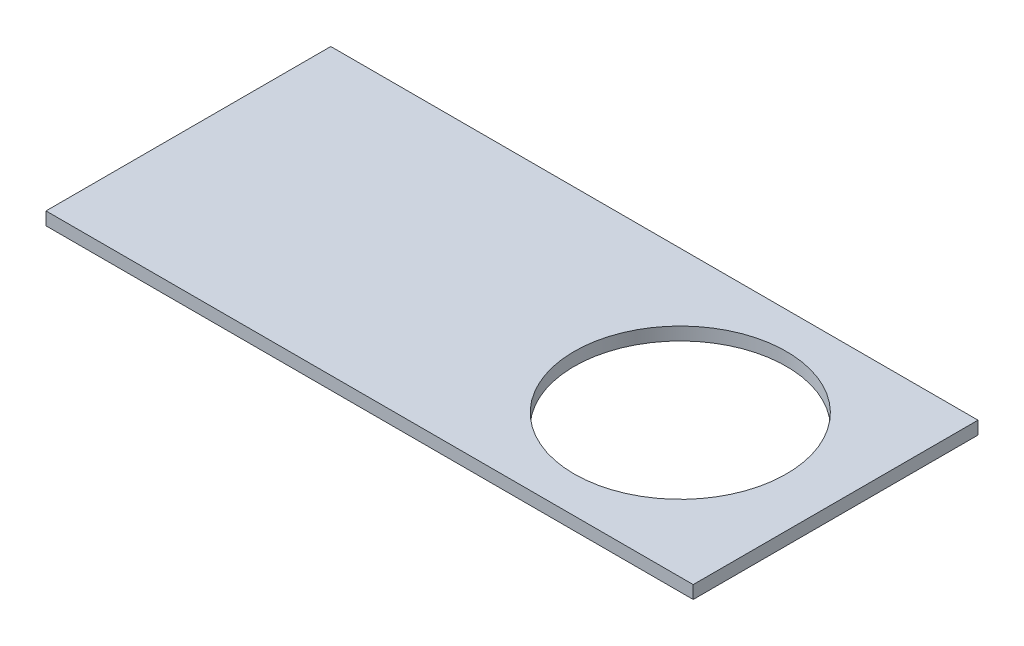
ISO-10303-21;
HEADER;
FILE_DESCRIPTION(('STEP AP214'),'2;1');
FILE_NAME('part.step','',(''),(''),'','','');
FILE_SCHEMA(('AUTOMOTIVE_DESIGN { 1 0 10303 214 1 1 1 1 }'));
ENDSEC;
DATA;
#1=APPLICATION_CONTEXT('core data for automotive mechanical design processes');
#2=APPLICATION_PROTOCOL_DEFINITION('international standard','automotive_design',2000,#1);
#3=PRODUCT_CONTEXT('',#1,'mechanical');
#4=PRODUCT('Part','Part','',(#3));
#5=PRODUCT_RELATED_PRODUCT_CATEGORY('part','',(#4));
#6=PRODUCT_DEFINITION_FORMATION('','',#4);
#7=PRODUCT_DEFINITION_CONTEXT('part definition',#1,'design');
#8=PRODUCT_DEFINITION('design','',#6,#7);
#9=PRODUCT_DEFINITION_SHAPE('','',#8);
#10=(LENGTH_UNIT() NAMED_UNIT(*) SI_UNIT(.MILLI.,.METRE.));
#11=(NAMED_UNIT(*) PLANE_ANGLE_UNIT() SI_UNIT($,.RADIAN.));
#12=(NAMED_UNIT(*) SI_UNIT($,.STERADIAN.) SOLID_ANGLE_UNIT());
#13=UNCERTAINTY_MEASURE_WITH_UNIT(LENGTH_MEASURE(1.E-05),#10,'distance_accuracy_value','');
#14=(GEOMETRIC_REPRESENTATION_CONTEXT(3) GLOBAL_UNCERTAINTY_ASSIGNED_CONTEXT((#13)) GLOBAL_UNIT_ASSIGNED_CONTEXT((#10,
#11,#12)) REPRESENTATION_CONTEXT('',''));
#15=CARTESIAN_POINT('',(0.,0.,0.));
#16=DIRECTION('',(0.,0.,1.));
#17=DIRECTION('',(1.,0.,0.));
#18=AXIS2_PLACEMENT_3D('',#15,#16,#17);
#19=CARTESIAN_POINT('',(0.,5.,0.));
#20=DIRECTION('',(0.,-1.,0.));
#21=DIRECTION('',(0.,0.,-1.));
#22=AXIS2_PLACEMENT_3D('',#19,#20,#21);
#23=PLANE('',#22);
#24=DIRECTION('',(0.,0.,-1.));
#25=VECTOR('',#24,1.);
#26=CARTESIAN_POINT('',(125.,5.,55.));
#27=LINE('',#26,#25);
#28=CARTESIAN_POINT('',(125.,5.,55.));
#29=VERTEX_POINT('',#28);
#30=CARTESIAN_POINT('',(125.,5.,-55.));
#31=VERTEX_POINT('',#30);
#32=EDGE_CURVE('E87',#29,#31,#27,.T.);
#33=ORIENTED_EDGE('',*,*,#32,.T.);
#34=DIRECTION('',(-1.,0.,0.));
#35=VECTOR('',#34,1.);
#36=CARTESIAN_POINT('',(-125.,5.,-54.9999999999999));
#37=LINE('',#36,#35);
#38=CARTESIAN_POINT('',(-125.,5.,-54.9999999999999));
#39=VERTEX_POINT('',#38);
#40=EDGE_CURVE('E82',#31,#39,#37,.T.);
#41=ORIENTED_EDGE('',*,*,#40,.T.);
#42=DIRECTION('',(0.,0.,1.));
#43=VECTOR('',#42,1.);
#44=CARTESIAN_POINT('',(-125.,5.,55.));
#45=LINE('',#44,#43);
#46=CARTESIAN_POINT('',(-125.,5.,55.));
#47=VERTEX_POINT('',#46);
#48=EDGE_CURVE('E85',#39,#47,#45,.T.);
#49=ORIENTED_EDGE('',*,*,#48,.T.);
#50=DIRECTION('',(1.,0.,0.));
#51=VECTOR('',#50,1.);
#52=CARTESIAN_POINT('',(-125.,5.,55.));
#53=LINE('',#52,#51);
#54=EDGE_CURVE('E52',#47,#29,#53,.T.);
#55=ORIENTED_EDGE('',*,*,#54,.T.);
#56=EDGE_LOOP('',(#33,#41,#49,#55));
#57=FACE_BOUND('',#56,.T.);
#58=CARTESIAN_POINT('',(65.,5.,0.));
#59=DIRECTION('',(0.,1.,0.));
#60=DIRECTION('',(0.,0.,1.));
#61=AXIS2_PLACEMENT_3D('',#58,#59,#60);
#62=CIRCLE('',#61,41.);
#63=CARTESIAN_POINT('',(65.,5.,41.));
#64=VERTEX_POINT('',#63);
#65=EDGE_CURVE('E102',#64,#64,#62,.T.);
#66=ORIENTED_EDGE('',*,*,#65,.F.);
#67=EDGE_LOOP('',(#66));
#68=FACE_BOUND('',#67,.T.);
#69=ADVANCED_FACE('F35',(#57,#68),#23,.F.);
#70=CARTESIAN_POINT('',(0.,0.,0.));
#71=DIRECTION('',(0.,-1.,0.));
#72=DIRECTION('',(0.,0.,-1.));
#73=AXIS2_PLACEMENT_3D('',#70,#71,#72);
#74=PLANE('',#73);
#75=DIRECTION('',(0.,0.,-1.));
#76=VECTOR('',#75,1.);
#77=CARTESIAN_POINT('',(125.,0.,55.));
#78=LINE('',#77,#76);
#79=CARTESIAN_POINT('',(125.,0.,55.));
#80=VERTEX_POINT('',#79);
#81=CARTESIAN_POINT('',(125.,0.,-55.));
#82=VERTEX_POINT('',#81);
#83=EDGE_CURVE('E99',#80,#82,#78,.T.);
#84=ORIENTED_EDGE('',*,*,#83,.F.);
#85=DIRECTION('',(1.,0.,0.));
#86=VECTOR('',#85,1.);
#87=CARTESIAN_POINT('',(-125.,0.,55.));
#88=LINE('',#87,#86);
#89=CARTESIAN_POINT('',(-125.,0.,55.));
#90=VERTEX_POINT('',#89);
#91=EDGE_CURVE('E75',#90,#80,#88,.T.);
#92=ORIENTED_EDGE('',*,*,#91,.F.);
#93=DIRECTION('',(0.,0.,1.));
#94=VECTOR('',#93,1.);
#95=CARTESIAN_POINT('',(-125.,0.,55.));
#96=LINE('',#95,#94);
#97=CARTESIAN_POINT('',(-125.,0.,-54.9999999999999));
#98=VERTEX_POINT('',#97);
#99=EDGE_CURVE('E69',#98,#90,#96,.T.);
#100=ORIENTED_EDGE('',*,*,#99,.F.);
#101=DIRECTION('',(-1.,0.,0.));
#102=VECTOR('',#101,1.);
#103=CARTESIAN_POINT('',(-125.,0.,-54.9999999999999));
#104=LINE('',#103,#102);
#105=EDGE_CURVE('E91',#82,#98,#104,.T.);
#106=ORIENTED_EDGE('',*,*,#105,.F.);
#107=EDGE_LOOP('',(#84,#92,#100,#106));
#108=FACE_BOUND('',#107,.T.);
#109=CARTESIAN_POINT('',(65.,0.,0.));
#110=DIRECTION('',(0.,1.,0.));
#111=DIRECTION('',(0.,0.,1.));
#112=AXIS2_PLACEMENT_3D('',#109,#110,#111);
#113=CIRCLE('',#112,41.);
#114=CARTESIAN_POINT('',(65.,0.,41.));
#115=VERTEX_POINT('',#114);
#116=EDGE_CURVE('E114',#115,#115,#113,.T.);
#117=ORIENTED_EDGE('',*,*,#116,.T.);
#118=EDGE_LOOP('',(#117));
#119=FACE_BOUND('',#118,.T.);
#120=ADVANCED_FACE('F110',(#108,#119),#74,.T.);
#121=CARTESIAN_POINT('',(125.,5.,55.));
#122=DIRECTION('',(-1.,0.,0.));
#123=DIRECTION('',(0.,0.,1.));
#124=AXIS2_PLACEMENT_3D('',#121,#122,#123);
#125=PLANE('',#124);
#126=ORIENTED_EDGE('',*,*,#83,.T.);
#127=DIRECTION('',(0.,-1.,0.));
#128=VECTOR('',#127,1.);
#129=CARTESIAN_POINT('',(125.,5.,-55.));
#130=LINE('',#129,#128);
#131=EDGE_CURVE('E11',#31,#82,#130,.T.);
#132=ORIENTED_EDGE('',*,*,#131,.F.);
#133=ORIENTED_EDGE('',*,*,#32,.F.);
#134=DIRECTION('',(0.,-1.,0.));
#135=VECTOR('',#134,1.);
#136=CARTESIAN_POINT('',(125.,5.,55.));
#137=LINE('',#136,#135);
#138=EDGE_CURVE('E95',#29,#80,#137,.T.);
#139=ORIENTED_EDGE('',*,*,#138,.T.);
#140=EDGE_LOOP('',(#126,#132,#133,#139));
#141=FACE_BOUND('',#140,.T.);
#142=ADVANCED_FACE('F37',(#141),#125,.F.);
#143=CARTESIAN_POINT('',(-125.,5.,-54.9999999999999));
#144=DIRECTION('',(0.,0.,1.));
#145=DIRECTION('',(1.,0.,0.));
#146=AXIS2_PLACEMENT_3D('',#143,#144,#145);
#147=PLANE('',#146);
#148=ORIENTED_EDGE('',*,*,#105,.T.);
#149=DIRECTION('',(0.,-1.,0.));
#150=VECTOR('',#149,1.);
#151=CARTESIAN_POINT('',(-125.,5.,-54.9999999999999));
#152=LINE('',#151,#150);
#153=EDGE_CURVE('E44',#39,#98,#152,.T.);
#154=ORIENTED_EDGE('',*,*,#153,.F.);
#155=ORIENTED_EDGE('',*,*,#40,.F.);
#156=ORIENTED_EDGE('',*,*,#131,.T.);
#157=EDGE_LOOP('',(#148,#154,#155,#156));
#158=FACE_BOUND('',#157,.T.);
#159=ADVANCED_FACE('F90',(#158),#147,.F.);
#160=CARTESIAN_POINT('',(-125.,5.,55.));
#161=DIRECTION('',(1.,0.,0.));
#162=DIRECTION('',(0.,0.,-1.));
#163=AXIS2_PLACEMENT_3D('',#160,#161,#162);
#164=PLANE('',#163);
#165=ORIENTED_EDGE('',*,*,#99,.T.);
#166=DIRECTION('',(0.,-1.,0.));
#167=VECTOR('',#166,1.);
#168=CARTESIAN_POINT('',(-125.,5.,55.));
#169=LINE('',#168,#167);
#170=EDGE_CURVE('E92',#47,#90,#169,.T.);
#171=ORIENTED_EDGE('',*,*,#170,.F.);
#172=ORIENTED_EDGE('',*,*,#48,.F.);
#173=ORIENTED_EDGE('',*,*,#153,.T.);
#174=EDGE_LOOP('',(#165,#171,#172,#173));
#175=FACE_BOUND('',#174,.T.);
#176=ADVANCED_FACE('F93',(#175),#164,.F.);
#177=CARTESIAN_POINT('',(-125.,5.,55.));
#178=DIRECTION('',(0.,0.,-1.));
#179=DIRECTION('',(-1.,0.,0.));
#180=AXIS2_PLACEMENT_3D('',#177,#178,#179);
#181=PLANE('',#180);
#182=ORIENTED_EDGE('',*,*,#91,.T.);
#183=ORIENTED_EDGE('',*,*,#138,.F.);
#184=ORIENTED_EDGE('',*,*,#54,.F.);
#185=ORIENTED_EDGE('',*,*,#170,.T.);
#186=EDGE_LOOP('',(#182,#183,#184,#185));
#187=FACE_BOUND('',#186,.T.);
#188=ADVANCED_FACE('F107',(#187),#181,.F.);
#189=CARTESIAN_POINT('',(65.,5.,0.));
#190=DIRECTION('',(0.,-1.,0.));
#191=DIRECTION('',(0.,0.,-1.));
#192=AXIS2_PLACEMENT_3D('',#189,#190,#191);
#193=CYLINDRICAL_SURFACE('',#192,41.);
#194=ORIENTED_EDGE('',*,*,#65,.T.);
#195=EDGE_LOOP('',(#194));
#196=FACE_BOUND('',#195,.T.);
#197=ORIENTED_EDGE('',*,*,#116,.F.);
#198=EDGE_LOOP('',(#197));
#199=FACE_BOUND('',#198,.T.);
#200=ADVANCED_FACE('F120',(#196,#199),#193,.F.);
#201=CLOSED_SHELL('',(#69,#120,#142,#159,#176,#188,#200));
#202=MANIFOLD_SOLID_BREP('B2',#201);
#203=ADVANCED_BREP_SHAPE_REPRESENTATION('',(#18,#202),#14);
#204=SHAPE_DEFINITION_REPRESENTATION(#9,#203);
ENDSEC;
END-ISO-10303-21;
